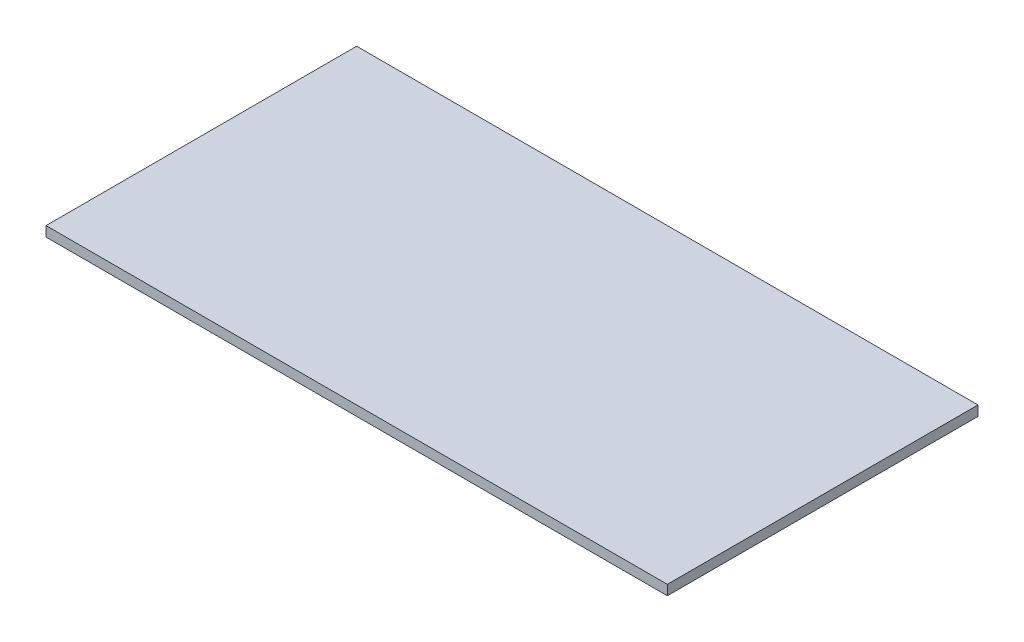
ISO-10303-21;
HEADER;
FILE_DESCRIPTION(('STEP AP214'),'2;1');
FILE_NAME('part.step','',(''),(''),'','','');
FILE_SCHEMA(('AUTOMOTIVE_DESIGN { 1 0 10303 214 1 1 1 1 }'));
ENDSEC;
DATA;
#1=APPLICATION_CONTEXT('core data for automotive mechanical design processes');
#2=APPLICATION_PROTOCOL_DEFINITION('international standard','automotive_design',2000,#1);
#3=PRODUCT_CONTEXT('',#1,'mechanical');
#4=PRODUCT('Part','Part','',(#3));
#5=PRODUCT_RELATED_PRODUCT_CATEGORY('part','',(#4));
#6=PRODUCT_DEFINITION_FORMATION('','',#4);
#7=PRODUCT_DEFINITION_CONTEXT('part definition',#1,'design');
#8=PRODUCT_DEFINITION('design','',#6,#7);
#9=PRODUCT_DEFINITION_SHAPE('','',#8);
#10=(LENGTH_UNIT() NAMED_UNIT(*) SI_UNIT(.MILLI.,.METRE.));
#11=(NAMED_UNIT(*) PLANE_ANGLE_UNIT() SI_UNIT($,.RADIAN.));
#12=(NAMED_UNIT(*) SI_UNIT($,.STERADIAN.) SOLID_ANGLE_UNIT());
#13=UNCERTAINTY_MEASURE_WITH_UNIT(LENGTH_MEASURE(1.E-05),#10,'distance_accuracy_value','');
#14=(GEOMETRIC_REPRESENTATION_CONTEXT(3) GLOBAL_UNCERTAINTY_ASSIGNED_CONTEXT((#13)) GLOBAL_UNIT_ASSIGNED_CONTEXT((#10,
#11,#12)) REPRESENTATION_CONTEXT('',''));
#15=CARTESIAN_POINT('',(0.,0.,0.));
#16=DIRECTION('',(0.,0.,1.));
#17=DIRECTION('',(1.,0.,0.));
#18=AXIS2_PLACEMENT_3D('',#15,#16,#17);
#19=CARTESIAN_POINT('',(50.,1.6,-25.));
#20=DIRECTION('',(-1.,0.,0.));
#21=DIRECTION('',(0.,0.,1.));
#22=AXIS2_PLACEMENT_3D('',#19,#20,#21);
#23=PLANE('',#22);
#24=DIRECTION('',(0.,0.,-1.));
#25=VECTOR('',#24,1.);
#26=CARTESIAN_POINT('',(50.,0.,-25.));
#27=LINE('',#26,#25);
#28=CARTESIAN_POINT('',(50.,0.,25.));
#29=VERTEX_POINT('',#28);
#30=CARTESIAN_POINT('',(50.,0.,-25.));
#31=VERTEX_POINT('',#30);
#32=EDGE_CURVE('E107',#29,#31,#27,.T.);
#33=ORIENTED_EDGE('',*,*,#32,.T.);
#34=DIRECTION('',(0.,-1.,0.));
#35=VECTOR('',#34,1.);
#36=CARTESIAN_POINT('',(50.,1.6,-25.));
#37=LINE('',#36,#35);
#38=CARTESIAN_POINT('',(50.,1.6,-25.));
#39=VERTEX_POINT('',#38);
#40=EDGE_CURVE('E11',#39,#31,#37,.T.);
#41=ORIENTED_EDGE('',*,*,#40,.F.);
#42=DIRECTION('',(0.,0.,-1.));
#43=VECTOR('',#42,1.);
#44=CARTESIAN_POINT('',(50.,1.6,-25.));
#45=LINE('',#44,#43);
#46=CARTESIAN_POINT('',(50.,1.6,25.));
#47=VERTEX_POINT('',#46);
#48=EDGE_CURVE('E91',#47,#39,#45,.T.);
#49=ORIENTED_EDGE('',*,*,#48,.F.);
#50=DIRECTION('',(0.,-1.,0.));
#51=VECTOR('',#50,1.);
#52=CARTESIAN_POINT('',(50.,1.6,25.));
#53=LINE('',#52,#51);
#54=EDGE_CURVE('E103',#47,#29,#53,.T.);
#55=ORIENTED_EDGE('',*,*,#54,.T.);
#56=EDGE_LOOP('',(#33,#41,#49,#55));
#57=FACE_BOUND('',#56,.T.);
#58=ADVANCED_FACE('F39',(#57),#23,.F.);
#59=CARTESIAN_POINT('',(-50.,1.6,-25.));
#60=DIRECTION('',(0.,0.,1.));
#61=DIRECTION('',(1.,0.,0.));
#62=AXIS2_PLACEMENT_3D('',#59,#60,#61);
#63=PLANE('',#62);
#64=DIRECTION('',(-1.,0.,0.));
#65=VECTOR('',#64,1.);
#66=CARTESIAN_POINT('',(-50.,0.,-25.));
#67=LINE('',#66,#65);
#68=CARTESIAN_POINT('',(-50.,0.,-25.));
#69=VERTEX_POINT('',#68);
#70=EDGE_CURVE('E96',#31,#69,#67,.T.);
#71=ORIENTED_EDGE('',*,*,#70,.T.);
#72=DIRECTION('',(0.,-1.,0.));
#73=VECTOR('',#72,1.);
#74=CARTESIAN_POINT('',(-50.,1.6,-25.));
#75=LINE('',#74,#73);
#76=CARTESIAN_POINT('',(-50.,1.6,-25.));
#77=VERTEX_POINT('',#76);
#78=EDGE_CURVE('E48',#77,#69,#75,.T.);
#79=ORIENTED_EDGE('',*,*,#78,.F.);
#80=DIRECTION('',(-1.,0.,0.));
#81=VECTOR('',#80,1.);
#82=CARTESIAN_POINT('',(-50.,1.6,-25.));
#83=LINE('',#82,#81);
#84=EDGE_CURVE('E86',#39,#77,#83,.T.);
#85=ORIENTED_EDGE('',*,*,#84,.F.);
#86=ORIENTED_EDGE('',*,*,#40,.T.);
#87=EDGE_LOOP('',(#71,#79,#85,#86));
#88=FACE_BOUND('',#87,.T.);
#89=ADVANCED_FACE('F95',(#88),#63,.F.);
#90=CARTESIAN_POINT('',(-50.,1.6,-25.));
#91=DIRECTION('',(1.,0.,0.));
#92=DIRECTION('',(0.,0.,-1.));
#93=AXIS2_PLACEMENT_3D('',#90,#91,#92);
#94=PLANE('',#93);
#95=DIRECTION('',(0.,0.,1.));
#96=VECTOR('',#95,1.);
#97=CARTESIAN_POINT('',(-50.,0.,-25.));
#98=LINE('',#97,#96);
#99=CARTESIAN_POINT('',(-50.,0.,25.));
#100=VERTEX_POINT('',#99);
#101=EDGE_CURVE('E73',#69,#100,#98,.T.);
#102=ORIENTED_EDGE('',*,*,#101,.T.);
#103=DIRECTION('',(0.,-1.,0.));
#104=VECTOR('',#103,1.);
#105=CARTESIAN_POINT('',(-50.,1.6,25.));
#106=LINE('',#105,#104);
#107=CARTESIAN_POINT('',(-50.,1.6,25.));
#108=VERTEX_POINT('',#107);
#109=EDGE_CURVE('E98',#108,#100,#106,.T.);
#110=ORIENTED_EDGE('',*,*,#109,.F.);
#111=DIRECTION('',(0.,0.,1.));
#112=VECTOR('',#111,1.);
#113=CARTESIAN_POINT('',(-50.,1.6,-25.));
#114=LINE('',#113,#112);
#115=EDGE_CURVE('E89',#77,#108,#114,.T.);
#116=ORIENTED_EDGE('',*,*,#115,.F.);
#117=ORIENTED_EDGE('',*,*,#78,.T.);
#118=EDGE_LOOP('',(#102,#110,#116,#117));
#119=FACE_BOUND('',#118,.T.);
#120=ADVANCED_FACE('F99',(#119),#94,.F.);
#121=CARTESIAN_POINT('',(-50.,1.6,25.));
#122=DIRECTION('',(0.,0.,-1.));
#123=DIRECTION('',(-1.,0.,0.));
#124=AXIS2_PLACEMENT_3D('',#121,#122,#123);
#125=PLANE('',#124);
#126=DIRECTION('',(1.,0.,0.));
#127=VECTOR('',#126,1.);
#128=CARTESIAN_POINT('',(-50.,0.,25.));
#129=LINE('',#128,#127);
#130=EDGE_CURVE('E79',#100,#29,#129,.T.);
#131=ORIENTED_EDGE('',*,*,#130,.T.);
#132=ORIENTED_EDGE('',*,*,#54,.F.);
#133=DIRECTION('',(1.,0.,0.));
#134=VECTOR('',#133,1.);
#135=CARTESIAN_POINT('',(-50.,1.6,25.));
#136=LINE('',#135,#134);
#137=EDGE_CURVE('E56',#108,#47,#136,.T.);
#138=ORIENTED_EDGE('',*,*,#137,.F.);
#139=ORIENTED_EDGE('',*,*,#109,.T.);
#140=EDGE_LOOP('',(#131,#132,#138,#139));
#141=FACE_BOUND('',#140,.T.);
#142=ADVANCED_FACE('F120',(#141),#125,.F.);
#143=CARTESIAN_POINT('',(0.,1.6,0.));
#144=DIRECTION('',(0.,1.,0.));
#145=DIRECTION('',(0.,0.,1.));
#146=AXIS2_PLACEMENT_3D('',#143,#144,#145);
#147=PLANE('',#146);
#148=ORIENTED_EDGE('',*,*,#48,.T.);
#149=ORIENTED_EDGE('',*,*,#84,.T.);
#150=ORIENTED_EDGE('',*,*,#115,.T.);
#151=ORIENTED_EDGE('',*,*,#137,.T.);
#152=EDGE_LOOP('',(#148,#149,#150,#151));
#153=FACE_BOUND('',#152,.T.);
#154=ADVANCED_FACE('F87',(#153),#147,.T.);
#155=CARTESIAN_POINT('',(0.,0.,0.));
#156=DIRECTION('',(0.,1.,0.));
#157=DIRECTION('',(0.,0.,1.));
#158=AXIS2_PLACEMENT_3D('',#155,#156,#157);
#159=PLANE('',#158);
#160=ORIENTED_EDGE('',*,*,#32,.F.);
#161=ORIENTED_EDGE('',*,*,#130,.F.);
#162=ORIENTED_EDGE('',*,*,#101,.F.);
#163=ORIENTED_EDGE('',*,*,#70,.F.);
#164=EDGE_LOOP('',(#160,#161,#162,#163));
#165=FACE_BOUND('',#164,.T.);
#166=ADVANCED_FACE('F123',(#165),#159,.F.);
#167=CLOSED_SHELL('',(#58,#89,#120,#142,#154,#166));
#168=MANIFOLD_SOLID_BREP('B2',#167);
#169=ADVANCED_BREP_SHAPE_REPRESENTATION('',(#18,#168),#14);
#170=SHAPE_DEFINITION_REPRESENTATION(#9,#169);
ENDSEC;
END-ISO-10303-21;
